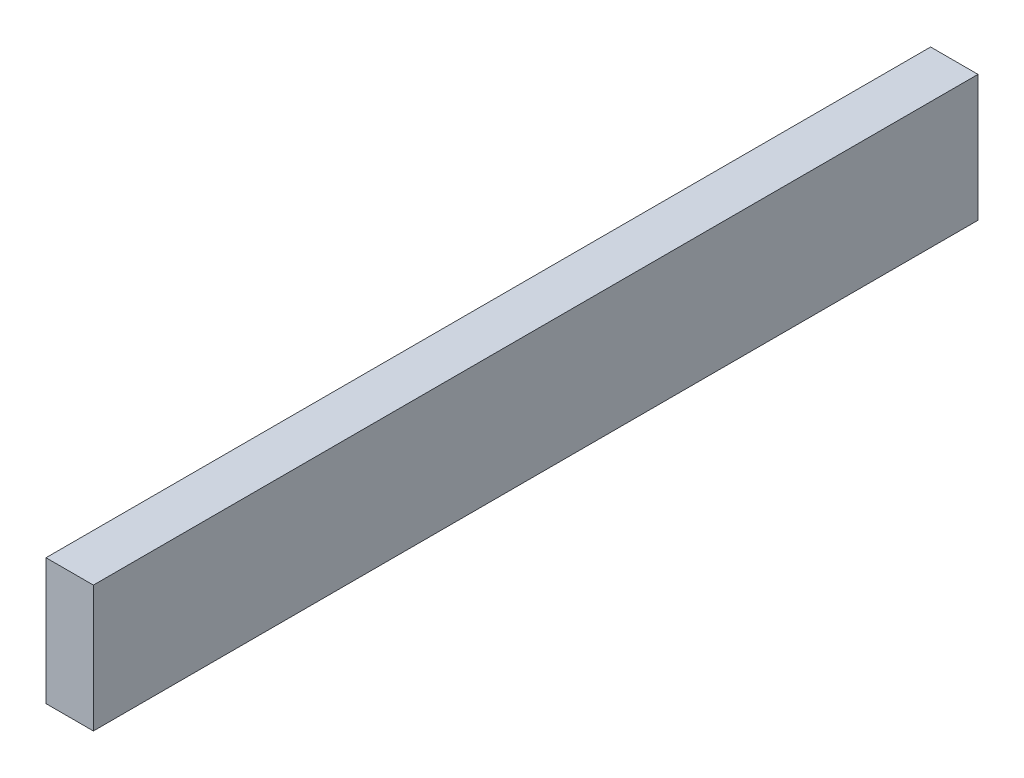
ISO-10303-21;
HEADER;
FILE_DESCRIPTION(('STEP AP214'),'2;1');
FILE_NAME('part.step','',(''),(''),'','','');
FILE_SCHEMA(('AUTOMOTIVE_DESIGN { 1 0 10303 214 1 1 1 1 }'));
ENDSEC;
DATA;
#1=APPLICATION_CONTEXT('core data for automotive mechanical design processes');
#2=APPLICATION_PROTOCOL_DEFINITION('international standard','automotive_design',2000,#1);
#3=PRODUCT_CONTEXT('',#1,'mechanical');
#4=PRODUCT('Part','Part','',(#3));
#5=PRODUCT_RELATED_PRODUCT_CATEGORY('part','',(#4));
#6=PRODUCT_DEFINITION_FORMATION('','',#4);
#7=PRODUCT_DEFINITION_CONTEXT('part definition',#1,'design');
#8=PRODUCT_DEFINITION('design','',#6,#7);
#9=PRODUCT_DEFINITION_SHAPE('','',#8);
#10=(LENGTH_UNIT() NAMED_UNIT(*) SI_UNIT(.MILLI.,.METRE.));
#11=(NAMED_UNIT(*) PLANE_ANGLE_UNIT() SI_UNIT($,.RADIAN.));
#12=(NAMED_UNIT(*) SI_UNIT($,.STERADIAN.) SOLID_ANGLE_UNIT());
#13=UNCERTAINTY_MEASURE_WITH_UNIT(LENGTH_MEASURE(1.E-05),#10,'distance_accuracy_value','');
#14=(GEOMETRIC_REPRESENTATION_CONTEXT(3) GLOBAL_UNCERTAINTY_ASSIGNED_CONTEXT((#13)) GLOBAL_UNIT_ASSIGNED_CONTEXT((#10,
#11,#12)) REPRESENTATION_CONTEXT('',''));
#15=CARTESIAN_POINT('',(0.,0.,0.));
#16=DIRECTION('',(0.,0.,1.));
#17=DIRECTION('',(1.,0.,0.));
#18=AXIS2_PLACEMENT_3D('',#15,#16,#17);
#19=CARTESIAN_POINT('',(9.525,-50.8,177.8));
#20=DIRECTION('',(1.,0.,0.));
#21=DIRECTION('',(0.,0.,-1.));
#22=AXIS2_PLACEMENT_3D('',#19,#20,#21);
#23=PLANE('',#22);
#24=DIRECTION('',(0.,0.,-1.));
#25=VECTOR('',#24,1.);
#26=CARTESIAN_POINT('',(9.525,0.,177.8));
#27=LINE('',#26,#25);
#28=CARTESIAN_POINT('',(9.525,0.,177.8));
#29=VERTEX_POINT('',#28);
#30=CARTESIAN_POINT('',(9.525,0.,-177.8));
#31=VERTEX_POINT('',#30);
#32=EDGE_CURVE('E99',#29,#31,#27,.T.);
#33=ORIENTED_EDGE('',*,*,#32,.F.);
#34=DIRECTION('',(0.,1.,0.));
#35=VECTOR('',#34,1.);
#36=CARTESIAN_POINT('',(9.525,-50.8,177.8));
#37=LINE('',#36,#35);
#38=CARTESIAN_POINT('',(9.525,-50.8,177.8));
#39=VERTEX_POINT('',#38);
#40=EDGE_CURVE('E11',#39,#29,#37,.T.);
#41=ORIENTED_EDGE('',*,*,#40,.F.);
#42=DIRECTION('',(0.,0.,-1.));
#43=VECTOR('',#42,1.);
#44=CARTESIAN_POINT('',(9.525,-50.8,177.8));
#45=LINE('',#44,#43);
#46=CARTESIAN_POINT('',(9.525,-50.8,-177.8));
#47=VERTEX_POINT('',#46);
#48=EDGE_CURVE('E93',#39,#47,#45,.T.);
#49=ORIENTED_EDGE('',*,*,#48,.T.);
#50=DIRECTION('',(0.,1.,0.));
#51=VECTOR('',#50,1.);
#52=CARTESIAN_POINT('',(9.525,-50.8,-177.8));
#53=LINE('',#52,#51);
#54=EDGE_CURVE('E38',#47,#31,#53,.T.);
#55=ORIENTED_EDGE('',*,*,#54,.T.);
#56=EDGE_LOOP('',(#33,#41,#49,#55));
#57=FACE_BOUND('',#56,.T.);
#58=ADVANCED_FACE('F35',(#57),#23,.T.);
#59=CARTESIAN_POINT('',(-9.525,-50.8,177.8));
#60=DIRECTION('',(0.,0.,1.));
#61=DIRECTION('',(1.,0.,0.));
#62=AXIS2_PLACEMENT_3D('',#59,#60,#61);
#63=PLANE('',#62);
#64=DIRECTION('',(1.,0.,0.));
#65=VECTOR('',#64,1.);
#66=CARTESIAN_POINT('',(-9.525,0.,177.8));
#67=LINE('',#66,#65);
#68=CARTESIAN_POINT('',(-9.525,0.,177.8));
#69=VERTEX_POINT('',#68);
#70=EDGE_CURVE('E95',#69,#29,#67,.T.);
#71=ORIENTED_EDGE('',*,*,#70,.F.);
#72=DIRECTION('',(0.,1.,0.));
#73=VECTOR('',#72,1.);
#74=CARTESIAN_POINT('',(-9.525,-50.8,177.8));
#75=LINE('',#74,#73);
#76=CARTESIAN_POINT('',(-9.525,-50.8,177.8));
#77=VERTEX_POINT('',#76);
#78=EDGE_CURVE('E44',#77,#69,#75,.T.);
#79=ORIENTED_EDGE('',*,*,#78,.F.);
#80=DIRECTION('',(1.,0.,0.));
#81=VECTOR('',#80,1.);
#82=CARTESIAN_POINT('',(-9.525,-50.8,177.8));
#83=LINE('',#82,#81);
#84=EDGE_CURVE('E90',#77,#39,#83,.T.);
#85=ORIENTED_EDGE('',*,*,#84,.T.);
#86=ORIENTED_EDGE('',*,*,#40,.T.);
#87=EDGE_LOOP('',(#71,#79,#85,#86));
#88=FACE_BOUND('',#87,.T.);
#89=ADVANCED_FACE('F109',(#88),#63,.T.);
#90=CARTESIAN_POINT('',(-9.525,-50.8,177.8));
#91=DIRECTION('',(-1.,0.,0.));
#92=DIRECTION('',(0.,0.,1.));
#93=AXIS2_PLACEMENT_3D('',#90,#91,#92);
#94=PLANE('',#93);
#95=DIRECTION('',(0.,0.,1.));
#96=VECTOR('',#95,1.);
#97=CARTESIAN_POINT('',(-9.525,0.,177.8));
#98=LINE('',#97,#96);
#99=CARTESIAN_POINT('',(-9.525,0.,-177.8));
#100=VERTEX_POINT('',#99);
#101=EDGE_CURVE('E85',#100,#69,#98,.T.);
#102=ORIENTED_EDGE('',*,*,#101,.F.);
#103=DIRECTION('',(0.,1.,0.));
#104=VECTOR('',#103,1.);
#105=CARTESIAN_POINT('',(-9.525,-50.8,-177.8));
#106=LINE('',#105,#104);
#107=CARTESIAN_POINT('',(-9.525,-50.8,-177.8));
#108=VERTEX_POINT('',#107);
#109=EDGE_CURVE('E80',#108,#100,#106,.T.);
#110=ORIENTED_EDGE('',*,*,#109,.F.);
#111=DIRECTION('',(0.,0.,1.));
#112=VECTOR('',#111,1.);
#113=CARTESIAN_POINT('',(-9.525,-50.8,177.8));
#114=LINE('',#113,#112);
#115=EDGE_CURVE('E83',#108,#77,#114,.T.);
#116=ORIENTED_EDGE('',*,*,#115,.T.);
#117=ORIENTED_EDGE('',*,*,#78,.T.);
#118=EDGE_LOOP('',(#102,#110,#116,#117));
#119=FACE_BOUND('',#118,.T.);
#120=ADVANCED_FACE('F82',(#119),#94,.T.);
#121=CARTESIAN_POINT('',(-9.525,-50.8,-177.8));
#122=DIRECTION('',(0.,0.,-1.));
#123=DIRECTION('',(-1.,0.,0.));
#124=AXIS2_PLACEMENT_3D('',#121,#122,#123);
#125=PLANE('',#124);
#126=DIRECTION('',(-1.,0.,0.));
#127=VECTOR('',#126,1.);
#128=CARTESIAN_POINT('',(-9.525,0.,-177.8));
#129=LINE('',#128,#127);
#130=EDGE_CURVE('E102',#31,#100,#129,.T.);
#131=ORIENTED_EDGE('',*,*,#130,.F.);
#132=ORIENTED_EDGE('',*,*,#54,.F.);
#133=DIRECTION('',(-1.,0.,0.));
#134=VECTOR('',#133,1.);
#135=CARTESIAN_POINT('',(-9.525,-50.8,-177.8));
#136=LINE('',#135,#134);
#137=EDGE_CURVE('E89',#47,#108,#136,.T.);
#138=ORIENTED_EDGE('',*,*,#137,.T.);
#139=ORIENTED_EDGE('',*,*,#109,.T.);
#140=EDGE_LOOP('',(#131,#132,#138,#139));
#141=FACE_BOUND('',#140,.T.);
#142=ADVANCED_FACE('F92',(#141),#125,.T.);
#143=CARTESIAN_POINT('',(0.,-50.8,0.));
#144=DIRECTION('',(0.,-1.,0.));
#145=DIRECTION('',(0.,0.,-1.));
#146=AXIS2_PLACEMENT_3D('',#143,#144,#145);
#147=PLANE('',#146);
#148=ORIENTED_EDGE('',*,*,#48,.F.);
#149=ORIENTED_EDGE('',*,*,#84,.F.);
#150=ORIENTED_EDGE('',*,*,#115,.F.);
#151=ORIENTED_EDGE('',*,*,#137,.F.);
#152=EDGE_LOOP('',(#148,#149,#150,#151));
#153=FACE_BOUND('',#152,.T.);
#154=ADVANCED_FACE('F88',(#153),#147,.T.);
#155=CARTESIAN_POINT('',(0.,0.,0.));
#156=DIRECTION('',(0.,-1.,0.));
#157=DIRECTION('',(0.,0.,-1.));
#158=AXIS2_PLACEMENT_3D('',#155,#156,#157);
#159=PLANE('',#158);
#160=ORIENTED_EDGE('',*,*,#32,.T.);
#161=ORIENTED_EDGE('',*,*,#130,.T.);
#162=ORIENTED_EDGE('',*,*,#101,.T.);
#163=ORIENTED_EDGE('',*,*,#70,.T.);
#164=EDGE_LOOP('',(#160,#161,#162,#163));
#165=FACE_BOUND('',#164,.T.);
#166=ADVANCED_FACE('F108',(#165),#159,.F.);
#167=CLOSED_SHELL('',(#58,#89,#120,#142,#154,#166));
#168=MANIFOLD_SOLID_BREP('B2',#167);
#169=ADVANCED_BREP_SHAPE_REPRESENTATION('',(#18,#168),#14);
#170=SHAPE_DEFINITION_REPRESENTATION(#9,#169);
ENDSEC;
END-ISO-10303-21;
